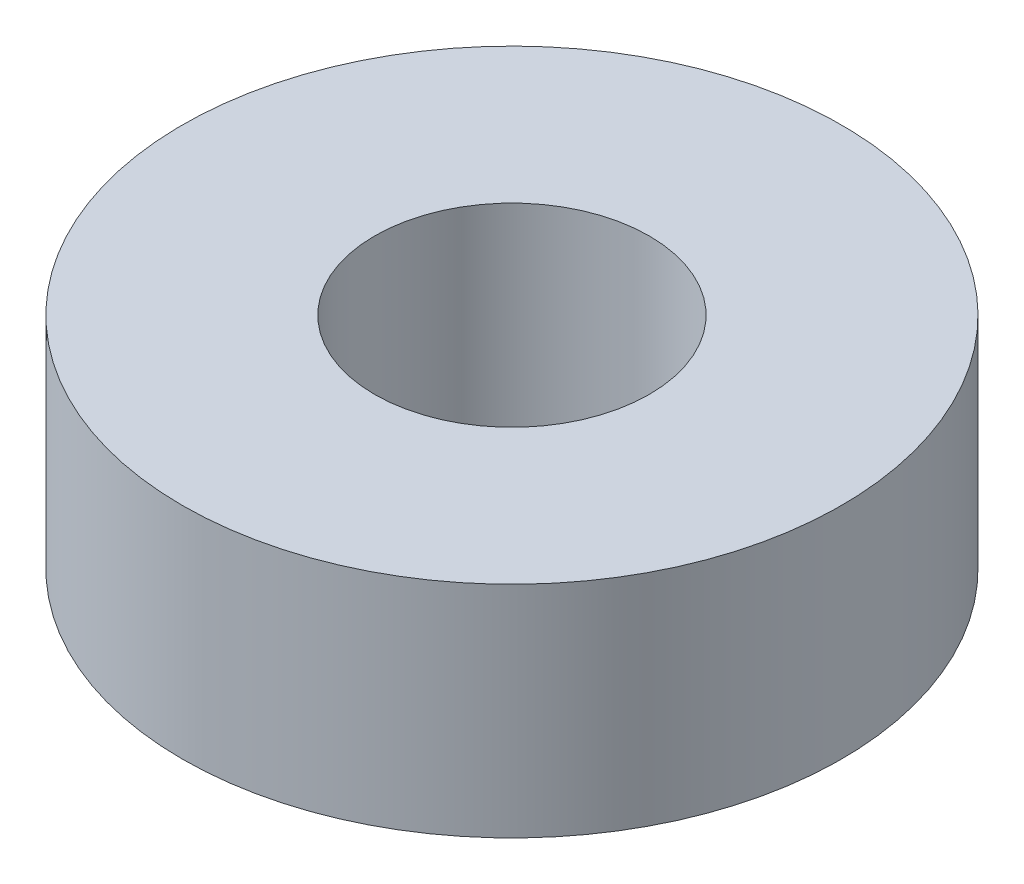
ISO-10303-21;
HEADER;
FILE_DESCRIPTION(('STEP AP214'),'2;1');
FILE_NAME('part.step','',(''),(''),'','','');
FILE_SCHEMA(('AUTOMOTIVE_DESIGN { 1 0 10303 214 1 1 1 1 }'));
ENDSEC;
DATA;
#1=APPLICATION_CONTEXT('core data for automotive mechanical design processes');
#2=APPLICATION_PROTOCOL_DEFINITION('international standard','automotive_design',2000,#1);
#3=PRODUCT_CONTEXT('',#1,'mechanical');
#4=PRODUCT('Part','Part','',(#3));
#5=PRODUCT_RELATED_PRODUCT_CATEGORY('part','',(#4));
#6=PRODUCT_DEFINITION_FORMATION('','',#4);
#7=PRODUCT_DEFINITION_CONTEXT('part definition',#1,'design');
#8=PRODUCT_DEFINITION('design','',#6,#7);
#9=PRODUCT_DEFINITION_SHAPE('','',#8);
#10=(LENGTH_UNIT() NAMED_UNIT(*) SI_UNIT(.MILLI.,.METRE.));
#11=(NAMED_UNIT(*) PLANE_ANGLE_UNIT() SI_UNIT($,.RADIAN.));
#12=(NAMED_UNIT(*) SI_UNIT($,.STERADIAN.) SOLID_ANGLE_UNIT());
#13=UNCERTAINTY_MEASURE_WITH_UNIT(LENGTH_MEASURE(1.E-05),#10,'distance_accuracy_value','');
#14=(GEOMETRIC_REPRESENTATION_CONTEXT(3) GLOBAL_UNCERTAINTY_ASSIGNED_CONTEXT((#13)) GLOBAL_UNIT_ASSIGNED_CONTEXT((#10,
#11,#12)) REPRESENTATION_CONTEXT('',''));
#15=CARTESIAN_POINT('',(0.,0.,0.));
#16=DIRECTION('',(0.,0.,1.));
#17=DIRECTION('',(1.,0.,0.));
#18=AXIS2_PLACEMENT_3D('',#15,#16,#17);
#19=CARTESIAN_POINT('',(0.,3.175,0.));
#20=DIRECTION('',(0.,1.,0.));
#21=DIRECTION('',(0.,0.,1.));
#22=AXIS2_PLACEMENT_3D('',#19,#20,#21);
#23=PLANE('',#22);
#24=CARTESIAN_POINT('',(0.,3.175,0.));
#25=DIRECTION('',(0.,1.,0.));
#26=DIRECTION('',(0.,0.,1.));
#27=AXIS2_PLACEMENT_3D('',#24,#25,#26);
#28=CIRCLE('',#27,4.7625);
#29=CARTESIAN_POINT('',(0.,3.175,4.7625));
#30=VERTEX_POINT('',#29);
#31=EDGE_CURVE('E10',#30,#30,#28,.T.);
#32=ORIENTED_EDGE('',*,*,#31,.T.);
#33=EDGE_LOOP('',(#32));
#34=FACE_BOUND('',#33,.T.);
#35=CARTESIAN_POINT('',(0.,3.175,0.));
#36=DIRECTION('',(0.,1.,0.));
#37=DIRECTION('',(0.,0.,1.));
#38=AXIS2_PLACEMENT_3D('',#35,#36,#37);
#39=CIRCLE('',#38,1.984375);
#40=CARTESIAN_POINT('',(0.,3.175,1.984375));
#41=VERTEX_POINT('',#40);
#42=EDGE_CURVE('E40',#41,#41,#39,.T.);
#43=ORIENTED_EDGE('',*,*,#42,.F.);
#44=EDGE_LOOP('',(#43));
#45=FACE_BOUND('',#44,.T.);
#46=ADVANCED_FACE('F29',(#34,#45),#23,.T.);
#47=CARTESIAN_POINT('',(0.,0.,0.));
#48=DIRECTION('',(0.,1.,0.));
#49=DIRECTION('',(0.,0.,1.));
#50=AXIS2_PLACEMENT_3D('',#47,#48,#49);
#51=PLANE('',#50);
#52=CARTESIAN_POINT('',(0.,0.,0.));
#53=DIRECTION('',(0.,1.,0.));
#54=DIRECTION('',(0.,0.,1.));
#55=AXIS2_PLACEMENT_3D('',#52,#53,#54);
#56=CIRCLE('',#55,4.7625);
#57=CARTESIAN_POINT('',(0.,0.,4.7625));
#58=VERTEX_POINT('',#57);
#59=EDGE_CURVE('E33',#58,#58,#56,.T.);
#60=ORIENTED_EDGE('',*,*,#59,.F.);
#61=EDGE_LOOP('',(#60));
#62=FACE_BOUND('',#61,.T.);
#63=CARTESIAN_POINT('',(0.,0.,0.));
#64=DIRECTION('',(0.,1.,0.));
#65=DIRECTION('',(0.,0.,1.));
#66=AXIS2_PLACEMENT_3D('',#63,#64,#65);
#67=CIRCLE('',#66,1.984375);
#68=CARTESIAN_POINT('',(0.,0.,1.984375));
#69=VERTEX_POINT('',#68);
#70=EDGE_CURVE('E42',#69,#69,#67,.T.);
#71=ORIENTED_EDGE('',*,*,#70,.T.);
#72=EDGE_LOOP('',(#71));
#73=FACE_BOUND('',#72,.T.);
#74=ADVANCED_FACE('F52',(#62,#73),#51,.F.);
#75=CARTESIAN_POINT('',(0.,3.175,0.));
#76=DIRECTION('',(0.,-1.,0.));
#77=DIRECTION('',(0.,0.,-1.));
#78=AXIS2_PLACEMENT_3D('',#75,#76,#77);
#79=CYLINDRICAL_SURFACE('',#78,4.7625);
#80=ORIENTED_EDGE('',*,*,#31,.F.);
#81=EDGE_LOOP('',(#80));
#82=FACE_BOUND('',#81,.T.);
#83=ORIENTED_EDGE('',*,*,#59,.T.);
#84=EDGE_LOOP('',(#83));
#85=FACE_BOUND('',#84,.T.);
#86=ADVANCED_FACE('F31',(#82,#85),#79,.T.);
#87=CARTESIAN_POINT('',(0.,3.175,0.));
#88=DIRECTION('',(0.,-1.,0.));
#89=DIRECTION('',(0.,0.,-1.));
#90=AXIS2_PLACEMENT_3D('',#87,#88,#89);
#91=CYLINDRICAL_SURFACE('',#90,1.984375);
#92=ORIENTED_EDGE('',*,*,#42,.T.);
#93=EDGE_LOOP('',(#92));
#94=FACE_BOUND('',#93,.T.);
#95=ORIENTED_EDGE('',*,*,#70,.F.);
#96=EDGE_LOOP('',(#95));
#97=FACE_BOUND('',#96,.T.);
#98=ADVANCED_FACE('F48',(#94,#97),#91,.F.);
#99=CLOSED_SHELL('',(#46,#74,#86,#98));
#100=MANIFOLD_SOLID_BREP('B2',#99);
#101=ADVANCED_BREP_SHAPE_REPRESENTATION('',(#18,#100),#14);
#102=SHAPE_DEFINITION_REPRESENTATION(#9,#101);
ENDSEC;
END-ISO-10303-21;
